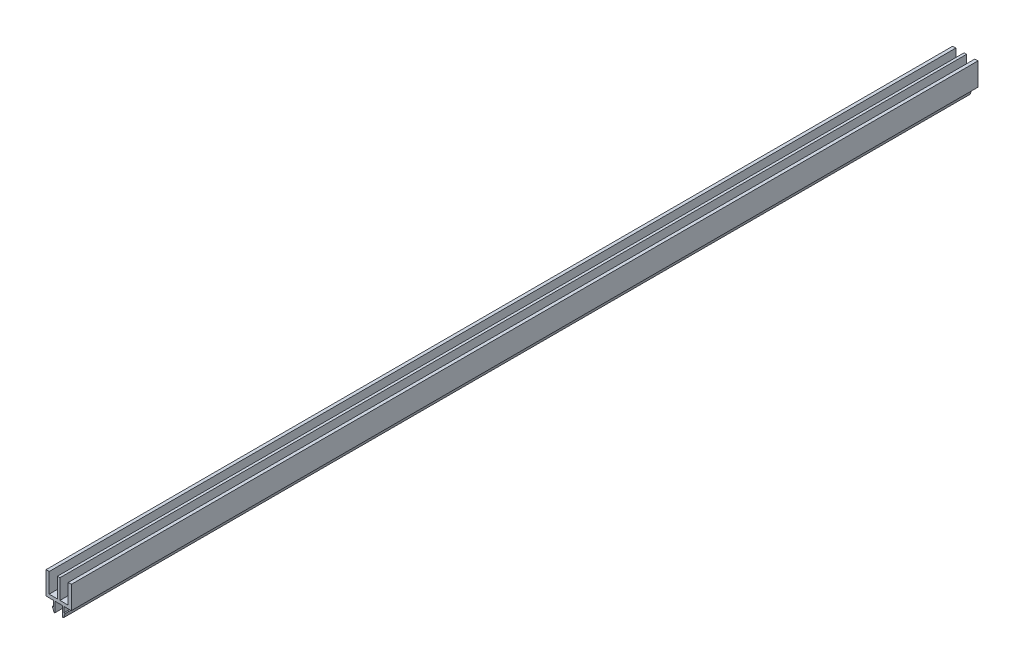
ISO-10303-21;
HEADER;
FILE_DESCRIPTION(('STEP AP214'),'2;1');
FILE_NAME('part.step','',(''),(''),'','','');
FILE_SCHEMA(('AUTOMOTIVE_DESIGN { 1 0 10303 214 1 1 1 1 }'));
ENDSEC;
DATA;
#1=APPLICATION_CONTEXT('core data for automotive mechanical design processes');
#2=APPLICATION_PROTOCOL_DEFINITION('international standard','automotive_design',2000,#1);
#3=PRODUCT_CONTEXT('',#1,'mechanical');
#4=PRODUCT('Part','Part','',(#3));
#5=PRODUCT_RELATED_PRODUCT_CATEGORY('part','',(#4));
#6=PRODUCT_DEFINITION_FORMATION('','',#4);
#7=PRODUCT_DEFINITION_CONTEXT('part definition',#1,'design');
#8=PRODUCT_DEFINITION('design','',#6,#7);
#9=PRODUCT_DEFINITION_SHAPE('','',#8);
#10=(LENGTH_UNIT() NAMED_UNIT(*) SI_UNIT(.MILLI.,.METRE.));
#11=(NAMED_UNIT(*) PLANE_ANGLE_UNIT() SI_UNIT($,.RADIAN.));
#12=(NAMED_UNIT(*) SI_UNIT($,.STERADIAN.) SOLID_ANGLE_UNIT());
#13=UNCERTAINTY_MEASURE_WITH_UNIT(LENGTH_MEASURE(1.E-05),#10,'distance_accuracy_value','');
#14=(GEOMETRIC_REPRESENTATION_CONTEXT(3) GLOBAL_UNCERTAINTY_ASSIGNED_CONTEXT((#13)) GLOBAL_UNIT_ASSIGNED_CONTEXT((#10,
#11,#12)) REPRESENTATION_CONTEXT('',''));
#15=CARTESIAN_POINT('',(0.,0.,0.));
#16=DIRECTION('',(0.,0.,1.));
#17=DIRECTION('',(1.,0.,0.));
#18=AXIS2_PLACEMENT_3D('',#15,#16,#17);
#19=CARTESIAN_POINT('',(-1.,17.9999999975,-665.));
#20=DIRECTION('',(-1.,0.,0.));
#21=DIRECTION('',(0.,-1.,0.));
#22=AXIS2_PLACEMENT_3D('',#19,#20,#21);
#23=PLANE('',#22);
#24=DIRECTION('',(0.,-1.,0.));
#25=VECTOR('',#24,1.);
#26=CARTESIAN_POINT('',(-1.,17.9999999975,50.));
#27=LINE('',#26,#25);
#28=CARTESIAN_POINT('',(-1.,17.9999999975,50.));
#29=VERTEX_POINT('',#28);
#30=CARTESIAN_POINT('',(-1.,2.4999999995,50.));
#31=VERTEX_POINT('',#30);
#32=EDGE_CURVE('E228',#29,#31,#27,.T.);
#33=ORIENTED_EDGE('',*,*,#32,.F.);
#34=DIRECTION('',(0.,0.,1.));
#35=VECTOR('',#34,1.);
#36=CARTESIAN_POINT('',(-1.,17.9999999975,-665.));
#37=LINE('',#36,#35);
#38=CARTESIAN_POINT('',(-1.,17.9999999975,-665.));
#39=VERTEX_POINT('',#38);
#40=EDGE_CURVE('E11',#39,#29,#37,.T.);
#41=ORIENTED_EDGE('',*,*,#40,.F.);
#42=DIRECTION('',(0.,-1.,0.));
#43=VECTOR('',#42,1.);
#44=CARTESIAN_POINT('',(-1.,17.9999999975,-665.));
#45=LINE('',#44,#43);
#46=CARTESIAN_POINT('',(-1.,2.4999999995,-665.));
#47=VERTEX_POINT('',#46);
#48=EDGE_CURVE('E296',#39,#47,#45,.T.);
#49=ORIENTED_EDGE('',*,*,#48,.T.);
#50=DIRECTION('',(0.,0.,1.));
#51=VECTOR('',#50,1.);
#52=CARTESIAN_POINT('',(-1.,2.4999999995,-665.));
#53=LINE('',#52,#51);
#54=EDGE_CURVE('E38',#47,#31,#53,.T.);
#55=ORIENTED_EDGE('',*,*,#54,.T.);
#56=EDGE_LOOP('',(#33,#41,#49,#55));
#57=FACE_BOUND('',#56,.T.);
#58=ADVANCED_FACE('F35',(#57),#23,.T.);
#59=CARTESIAN_POINT('',(0.999999999999998,17.9999999975,-665.));
#60=DIRECTION('',(0.,1.,0.));
#61=DIRECTION('',(0.,0.,1.));
#62=AXIS2_PLACEMENT_3D('',#59,#60,#61);
#63=PLANE('',#62);
#64=DIRECTION('',(-1.,0.,0.));
#65=VECTOR('',#64,1.);
#66=CARTESIAN_POINT('',(0.999999999999998,17.9999999975,50.));
#67=LINE('',#66,#65);
#68=CARTESIAN_POINT('',(0.999999999999998,17.9999999975,50.));
#69=VERTEX_POINT('',#68);
#70=EDGE_CURVE('E294',#69,#29,#67,.T.);
#71=ORIENTED_EDGE('',*,*,#70,.F.);
#72=DIRECTION('',(0.,0.,1.));
#73=VECTOR('',#72,1.);
#74=CARTESIAN_POINT('',(0.999999999999998,17.9999999975,-665.));
#75=LINE('',#74,#73);
#76=CARTESIAN_POINT('',(0.999999999999998,17.9999999975,-665.));
#77=VERTEX_POINT('',#76);
#78=EDGE_CURVE('E44',#77,#69,#75,.T.);
#79=ORIENTED_EDGE('',*,*,#78,.F.);
#80=DIRECTION('',(-1.,0.,0.));
#81=VECTOR('',#80,1.);
#82=CARTESIAN_POINT('',(0.999999999999998,17.9999999975,-665.));
#83=LINE('',#82,#81);
#84=EDGE_CURVE('E218',#77,#39,#83,.T.);
#85=ORIENTED_EDGE('',*,*,#84,.T.);
#86=ORIENTED_EDGE('',*,*,#40,.T.);
#87=EDGE_LOOP('',(#71,#79,#85,#86));
#88=FACE_BOUND('',#87,.T.);
#89=ADVANCED_FACE('F340',(#88),#63,.T.);
#90=CARTESIAN_POINT('',(0.999999999999998,2.4999999995,-665.));
#91=DIRECTION('',(1.,0.,0.));
#92=DIRECTION('',(0.,0.,-1.));
#93=AXIS2_PLACEMENT_3D('',#90,#91,#92);
#94=PLANE('',#93);
#95=DIRECTION('',(0.,1.,0.));
#96=VECTOR('',#95,1.);
#97=CARTESIAN_POINT('',(0.999999999999998,2.4999999995,50.));
#98=LINE('',#97,#96);
#99=CARTESIAN_POINT('',(0.999999999999998,2.4999999995,50.));
#100=VERTEX_POINT('',#99);
#101=EDGE_CURVE('E205',#100,#69,#98,.T.);
#102=ORIENTED_EDGE('',*,*,#101,.F.);
#103=DIRECTION('',(0.,0.,1.));
#104=VECTOR('',#103,1.);
#105=CARTESIAN_POINT('',(0.999999999999998,2.4999999995,-665.));
#106=LINE('',#105,#104);
#107=CARTESIAN_POINT('',(0.999999999999998,2.4999999995,-665.));
#108=VERTEX_POINT('',#107);
#109=EDGE_CURVE('E200',#108,#100,#106,.T.);
#110=ORIENTED_EDGE('',*,*,#109,.F.);
#111=DIRECTION('',(0.,1.,0.));
#112=VECTOR('',#111,1.);
#113=CARTESIAN_POINT('',(0.999999999999998,2.4999999995,-665.));
#114=LINE('',#113,#112);
#115=EDGE_CURVE('E203',#108,#77,#114,.T.);
#116=ORIENTED_EDGE('',*,*,#115,.T.);
#117=ORIENTED_EDGE('',*,*,#78,.T.);
#118=EDGE_LOOP('',(#102,#110,#116,#117));
#119=FACE_BOUND('',#118,.T.);
#120=ADVANCED_FACE('F202',(#119),#94,.T.);
#121=CARTESIAN_POINT('',(7.5,2.4999999995,-665.));
#122=DIRECTION('',(0.,1.,0.));
#123=DIRECTION('',(-1.,0.,0.));
#124=AXIS2_PLACEMENT_3D('',#121,#122,#123);
#125=PLANE('',#124);
#126=DIRECTION('',(-1.,0.,0.));
#127=VECTOR('',#126,1.);
#128=CARTESIAN_POINT('',(7.5,2.4999999995,50.));
#129=LINE('',#128,#127);
#130=CARTESIAN_POINT('',(7.5,2.4999999995,50.));
#131=VERTEX_POINT('',#130);
#132=EDGE_CURVE('E291',#131,#100,#129,.T.);
#133=ORIENTED_EDGE('',*,*,#132,.F.);
#134=DIRECTION('',(0.,0.,1.));
#135=VECTOR('',#134,1.);
#136=CARTESIAN_POINT('',(7.5,2.4999999995,-665.));
#137=LINE('',#136,#135);
#138=CARTESIAN_POINT('',(7.5,2.4999999995,-665.));
#139=VERTEX_POINT('',#138);
#140=EDGE_CURVE('E210',#139,#131,#137,.T.);
#141=ORIENTED_EDGE('',*,*,#140,.F.);
#142=DIRECTION('',(-1.,0.,0.));
#143=VECTOR('',#142,1.);
#144=CARTESIAN_POINT('',(7.5,2.4999999995,-665.));
#145=LINE('',#144,#143);
#146=EDGE_CURVE('E216',#139,#108,#145,.T.);
#147=ORIENTED_EDGE('',*,*,#146,.T.);
#148=ORIENTED_EDGE('',*,*,#109,.T.);
#149=EDGE_LOOP('',(#133,#141,#147,#148));
#150=FACE_BOUND('',#149,.T.);
#151=ADVANCED_FACE('F220',(#150),#125,.T.);
#152=CARTESIAN_POINT('',(7.5,17.9999999975,-665.));
#153=DIRECTION('',(-1.,0.,0.));
#154=DIRECTION('',(0.,-1.,0.));
#155=AXIS2_PLACEMENT_3D('',#152,#153,#154);
#156=PLANE('',#155);
#157=DIRECTION('',(0.,-1.,0.));
#158=VECTOR('',#157,1.);
#159=CARTESIAN_POINT('',(7.5,17.9999999975,50.));
#160=LINE('',#159,#158);
#161=CARTESIAN_POINT('',(7.5,17.9999999975,50.));
#162=VERTEX_POINT('',#161);
#163=EDGE_CURVE('E288',#162,#131,#160,.T.);
#164=ORIENTED_EDGE('',*,*,#163,.F.);
#165=DIRECTION('',(0.,0.,1.));
#166=VECTOR('',#165,1.);
#167=CARTESIAN_POINT('',(7.5,17.9999999975,-665.));
#168=LINE('',#167,#166);
#169=CARTESIAN_POINT('',(7.5,17.9999999975,-665.));
#170=VERTEX_POINT('',#169);
#171=EDGE_CURVE('E300',#170,#162,#168,.T.);
#172=ORIENTED_EDGE('',*,*,#171,.F.);
#173=DIRECTION('',(0.,-1.,0.));
#174=VECTOR('',#173,1.);
#175=CARTESIAN_POINT('',(7.5,17.9999999975,-665.));
#176=LINE('',#175,#174);
#177=EDGE_CURVE('E221',#170,#139,#176,.T.);
#178=ORIENTED_EDGE('',*,*,#177,.T.);
#179=ORIENTED_EDGE('',*,*,#140,.T.);
#180=EDGE_LOOP('',(#164,#172,#178,#179));
#181=FACE_BOUND('',#180,.T.);
#182=ADVANCED_FACE('F353',(#181),#156,.T.);
#183=CARTESIAN_POINT('',(10.,17.9999999975,-665.));
#184=DIRECTION('',(0.,1.,0.));
#185=DIRECTION('',(0.,0.,1.));
#186=AXIS2_PLACEMENT_3D('',#183,#184,#185);
#187=PLANE('',#186);
#188=DIRECTION('',(-1.,0.,0.));
#189=VECTOR('',#188,1.);
#190=CARTESIAN_POINT('',(10.,17.9999999975,50.));
#191=LINE('',#190,#189);
#192=CARTESIAN_POINT('',(10.,17.9999999975,50.));
#193=VERTEX_POINT('',#192);
#194=EDGE_CURVE('E285',#193,#162,#191,.T.);
#195=ORIENTED_EDGE('',*,*,#194,.F.);
#196=DIRECTION('',(0.,0.,1.));
#197=VECTOR('',#196,1.);
#198=CARTESIAN_POINT('',(10.,17.9999999975,-665.));
#199=LINE('',#198,#197);
#200=CARTESIAN_POINT('',(10.,17.9999999975,-665.));
#201=VERTEX_POINT('',#200);
#202=EDGE_CURVE('E302',#201,#193,#199,.T.);
#203=ORIENTED_EDGE('',*,*,#202,.F.);
#204=DIRECTION('',(-1.,0.,0.));
#205=VECTOR('',#204,1.);
#206=CARTESIAN_POINT('',(10.,17.9999999975,-665.));
#207=LINE('',#206,#205);
#208=EDGE_CURVE('E223',#201,#170,#207,.T.);
#209=ORIENTED_EDGE('',*,*,#208,.T.);
#210=ORIENTED_EDGE('',*,*,#171,.T.);
#211=EDGE_LOOP('',(#195,#203,#209,#210));
#212=FACE_BOUND('',#211,.T.);
#213=ADVANCED_FACE('F356',(#212),#187,.T.);
#214=CARTESIAN_POINT('',(10.,-4.99999828349541E-10,-665.));
#215=DIRECTION('',(1.,0.,0.));
#216=DIRECTION('',(0.,0.,-1.));
#217=AXIS2_PLACEMENT_3D('',#214,#215,#216);
#218=PLANE('',#217);
#219=DIRECTION('',(0.,1.,0.));
#220=VECTOR('',#219,1.);
#221=CARTESIAN_POINT('',(10.,-4.99999828349541E-10,50.));
#222=LINE('',#221,#220);
#223=CARTESIAN_POINT('',(10.,-4.99999828349541E-10,50.));
#224=VERTEX_POINT('',#223);
#225=EDGE_CURVE('E282',#224,#193,#222,.T.);
#226=ORIENTED_EDGE('',*,*,#225,.F.);
#227=DIRECTION('',(0.,0.,1.));
#228=VECTOR('',#227,1.);
#229=CARTESIAN_POINT('',(10.,-4.99999828349541E-10,-665.));
#230=LINE('',#229,#228);
#231=CARTESIAN_POINT('',(10.,-4.99999828349541E-10,-665.));
#232=VERTEX_POINT('',#231);
#233=EDGE_CURVE('E304',#232,#224,#230,.T.);
#234=ORIENTED_EDGE('',*,*,#233,.F.);
#235=DIRECTION('',(0.,1.,0.));
#236=VECTOR('',#235,1.);
#237=CARTESIAN_POINT('',(10.,-4.99999828349541E-10,-665.));
#238=LINE('',#237,#236);
#239=EDGE_CURVE('E646',#232,#201,#238,.T.);
#240=ORIENTED_EDGE('',*,*,#239,.T.);
#241=ORIENTED_EDGE('',*,*,#202,.T.);
#242=EDGE_LOOP('',(#226,#234,#240,#241));
#243=FACE_BOUND('',#242,.T.);
#244=ADVANCED_FACE('F360',(#243),#218,.T.);
#245=CARTESIAN_POINT('',(4.,-4.99999998002099E-10,-665.));
#246=DIRECTION('',(0.,-1.,0.));
#247=DIRECTION('',(1.,0.,0.));
#248=AXIS2_PLACEMENT_3D('',#245,#246,#247);
#249=PLANE('',#248);
#250=DIRECTION('',(1.,0.,0.));
#251=VECTOR('',#250,1.);
#252=CARTESIAN_POINT('',(4.,-4.99999998002099E-10,50.));
#253=LINE('',#252,#251);
#254=CARTESIAN_POINT('',(4.,-4.99999998002099E-10,50.));
#255=VERTEX_POINT('',#254);
#256=EDGE_CURVE('E279',#255,#224,#253,.T.);
#257=ORIENTED_EDGE('',*,*,#256,.F.);
#258=DIRECTION('',(0.,0.,1.));
#259=VECTOR('',#258,1.);
#260=CARTESIAN_POINT('',(4.,-4.99999998002099E-10,-665.));
#261=LINE('',#260,#259);
#262=CARTESIAN_POINT('',(4.,-4.99999998002099E-10,-665.));
#263=VERTEX_POINT('',#262);
#264=EDGE_CURVE('E306',#263,#255,#261,.T.);
#265=ORIENTED_EDGE('',*,*,#264,.F.);
#266=DIRECTION('',(1.,0.,0.));
#267=VECTOR('',#266,1.);
#268=CARTESIAN_POINT('',(4.,-4.99999998002099E-10,-665.));
#269=LINE('',#268,#267);
#270=EDGE_CURVE('E650',#263,#232,#269,.T.);
#271=ORIENTED_EDGE('',*,*,#270,.T.);
#272=ORIENTED_EDGE('',*,*,#233,.T.);
#273=EDGE_LOOP('',(#257,#265,#271,#272));
#274=FACE_BOUND('',#273,.T.);
#275=ADVANCED_FACE('F364',(#274),#249,.T.);
#276=CARTESIAN_POINT('',(4.,-4.5,-665.));
#277=DIRECTION('',(1.,0.,0.));
#278=DIRECTION('',(0.,0.,-1.));
#279=AXIS2_PLACEMENT_3D('',#276,#277,#278);
#280=PLANE('',#279);
#281=DIRECTION('',(0.,1.,0.));
#282=VECTOR('',#281,1.);
#283=CARTESIAN_POINT('',(4.,-4.5,50.));
#284=LINE('',#283,#282);
#285=CARTESIAN_POINT('',(4.,-4.5,50.));
#286=VERTEX_POINT('',#285);
#287=EDGE_CURVE('E276',#286,#255,#284,.T.);
#288=ORIENTED_EDGE('',*,*,#287,.F.);
#289=DIRECTION('',(0.,0.,1.));
#290=VECTOR('',#289,1.);
#291=CARTESIAN_POINT('',(4.,-4.5,-665.));
#292=LINE('',#291,#290);
#293=CARTESIAN_POINT('',(4.,-4.5,-665.));
#294=VERTEX_POINT('',#293);
#295=EDGE_CURVE('E308',#294,#286,#292,.T.);
#296=ORIENTED_EDGE('',*,*,#295,.F.);
#297=DIRECTION('',(0.,1.,0.));
#298=VECTOR('',#297,1.);
#299=CARTESIAN_POINT('',(4.,-4.5,-665.));
#300=LINE('',#299,#298);
#301=EDGE_CURVE('E639',#294,#263,#300,.T.);
#302=ORIENTED_EDGE('',*,*,#301,.T.);
#303=ORIENTED_EDGE('',*,*,#264,.T.);
#304=EDGE_LOOP('',(#288,#296,#302,#303));
#305=FACE_BOUND('',#304,.T.);
#306=ADVANCED_FACE('F368',(#305),#280,.T.);
#307=CARTESIAN_POINT('',(5.,-4.5,-665.));
#308=DIRECTION('',(0.,1.,0.));
#309=DIRECTION('',(0.,0.,1.));
#310=AXIS2_PLACEMENT_3D('',#307,#308,#309);
#311=PLANE('',#310);
#312=DIRECTION('',(-1.,0.,0.));
#313=VECTOR('',#312,1.);
#314=CARTESIAN_POINT('',(5.,-4.5,50.));
#315=LINE('',#314,#313);
#316=CARTESIAN_POINT('',(5.,-4.5,50.));
#317=VERTEX_POINT('',#316);
#318=EDGE_CURVE('E273',#317,#286,#315,.T.);
#319=ORIENTED_EDGE('',*,*,#318,.F.);
#320=DIRECTION('',(0.,0.,1.));
#321=VECTOR('',#320,1.);
#322=CARTESIAN_POINT('',(5.,-4.5,-665.));
#323=LINE('',#322,#321);
#324=CARTESIAN_POINT('',(5.,-4.5,-665.));
#325=VERTEX_POINT('',#324);
#326=EDGE_CURVE('E310',#325,#317,#323,.T.);
#327=ORIENTED_EDGE('',*,*,#326,.F.);
#328=DIRECTION('',(-1.,0.,0.));
#329=VECTOR('',#328,1.);
#330=CARTESIAN_POINT('',(5.,-4.5,-665.));
#331=LINE('',#330,#329);
#332=EDGE_CURVE('E635',#325,#294,#331,.T.);
#333=ORIENTED_EDGE('',*,*,#332,.T.);
#334=ORIENTED_EDGE('',*,*,#295,.T.);
#335=EDGE_LOOP('',(#319,#327,#333,#334));
#336=FACE_BOUND('',#335,.T.);
#337=ADVANCED_FACE('F372',(#336),#311,.T.);
#338=CARTESIAN_POINT('',(3.75,-8.,-665.));
#339=DIRECTION('',(0.941741911594837,-0.336336396998156,0.));
#340=DIRECTION('',(0.336336396998157,0.941741911594838,0.));
#341=AXIS2_PLACEMENT_3D('',#338,#339,#340);
#342=PLANE('',#341);
#343=DIRECTION('',(0.336336396998157,0.941741911594837,0.));
#344=VECTOR('',#343,1.);
#345=CARTESIAN_POINT('',(3.75,-8.,50.));
#346=LINE('',#345,#344);
#347=CARTESIAN_POINT('',(3.75,-8.,50.));
#348=VERTEX_POINT('',#347);
#349=EDGE_CURVE('E270',#348,#317,#346,.T.);
#350=ORIENTED_EDGE('',*,*,#349,.F.);
#351=DIRECTION('',(0.,0.,1.));
#352=VECTOR('',#351,1.);
#353=CARTESIAN_POINT('',(3.75,-8.,-665.));
#354=LINE('',#353,#352);
#355=CARTESIAN_POINT('',(3.75,-8.,-665.));
#356=VERTEX_POINT('',#355);
#357=EDGE_CURVE('E312',#356,#348,#354,.T.);
#358=ORIENTED_EDGE('',*,*,#357,.F.);
#359=DIRECTION('',(0.336336396998157,0.941741911594837,0.));
#360=VECTOR('',#359,1.);
#361=CARTESIAN_POINT('',(3.75,-8.,-665.));
#362=LINE('',#361,#360);
#363=EDGE_CURVE('E656',#356,#325,#362,.T.);
#364=ORIENTED_EDGE('',*,*,#363,.T.);
#365=ORIENTED_EDGE('',*,*,#326,.T.);
#366=EDGE_LOOP('',(#350,#358,#364,#365));
#367=FACE_BOUND('',#366,.T.);
#368=ADVANCED_FACE('F376',(#367),#342,.T.);
#369=CARTESIAN_POINT('',(3.,-8.,-665.));
#370=DIRECTION('',(0.,-1.,0.));
#371=DIRECTION('',(0.,0.,-1.));
#372=AXIS2_PLACEMENT_3D('',#369,#370,#371);
#373=PLANE('',#372);
#374=DIRECTION('',(1.,0.,0.));
#375=VECTOR('',#374,1.);
#376=CARTESIAN_POINT('',(3.,-8.,50.));
#377=LINE('',#376,#375);
#378=CARTESIAN_POINT('',(3.,-8.,50.));
#379=VERTEX_POINT('',#378);
#380=EDGE_CURVE('E267',#379,#348,#377,.T.);
#381=ORIENTED_EDGE('',*,*,#380,.F.);
#382=DIRECTION('',(0.,0.,1.));
#383=VECTOR('',#382,1.);
#384=CARTESIAN_POINT('',(3.,-8.,-665.));
#385=LINE('',#384,#383);
#386=CARTESIAN_POINT('',(3.,-8.,-665.));
#387=VERTEX_POINT('',#386);
#388=EDGE_CURVE('E314',#387,#379,#385,.T.);
#389=ORIENTED_EDGE('',*,*,#388,.F.);
#390=DIRECTION('',(1.,0.,0.));
#391=VECTOR('',#390,1.);
#392=CARTESIAN_POINT('',(3.,-8.,-665.));
#393=LINE('',#392,#391);
#394=EDGE_CURVE('E628',#387,#356,#393,.T.);
#395=ORIENTED_EDGE('',*,*,#394,.T.);
#396=ORIENTED_EDGE('',*,*,#357,.T.);
#397=EDGE_LOOP('',(#381,#389,#395,#396));
#398=FACE_BOUND('',#397,.T.);
#399=ADVANCED_FACE('F380',(#398),#373,.T.);
#400=CARTESIAN_POINT('',(3.,-4.9999985194348E-10,-665.));
#401=DIRECTION('',(-1.,0.,0.));
#402=DIRECTION('',(0.,0.,1.));
#403=AXIS2_PLACEMENT_3D('',#400,#401,#402);
#404=PLANE('',#403);
#405=DIRECTION('',(0.,-1.,0.));
#406=VECTOR('',#405,1.);
#407=CARTESIAN_POINT('',(3.,-4.9999985194348E-10,50.));
#408=LINE('',#407,#406);
#409=CARTESIAN_POINT('',(3.,-4.9999985194348E-10,50.));
#410=VERTEX_POINT('',#409);
#411=EDGE_CURVE('E264',#410,#379,#408,.T.);
#412=ORIENTED_EDGE('',*,*,#411,.F.);
#413=DIRECTION('',(0.,0.,1.));
#414=VECTOR('',#413,1.);
#415=CARTESIAN_POINT('',(3.,-4.9999985194348E-10,-665.));
#416=LINE('',#415,#414);
#417=CARTESIAN_POINT('',(3.,-4.9999985194348E-10,-665.));
#418=VERTEX_POINT('',#417);
#419=EDGE_CURVE('E316',#418,#410,#416,.T.);
#420=ORIENTED_EDGE('',*,*,#419,.F.);
#421=DIRECTION('',(0.,-1.,0.));
#422=VECTOR('',#421,1.);
#423=CARTESIAN_POINT('',(3.,-4.9999985194348E-10,-665.));
#424=LINE('',#423,#422);
#425=EDGE_CURVE('E624',#418,#387,#424,.T.);
#426=ORIENTED_EDGE('',*,*,#425,.T.);
#427=ORIENTED_EDGE('',*,*,#388,.T.);
#428=EDGE_LOOP('',(#412,#420,#426,#427));
#429=FACE_BOUND('',#428,.T.);
#430=ADVANCED_FACE('F384',(#429),#404,.T.);
#431=CARTESIAN_POINT('',(-3.,-4.99999455901012E-10,-665.));
#432=DIRECTION('',(0.,-1.,0.));
#433=DIRECTION('',(1.,0.,0.));
#434=AXIS2_PLACEMENT_3D('',#431,#432,#433);
#435=PLANE('',#434);
#436=DIRECTION('',(1.,0.,0.));
#437=VECTOR('',#436,1.);
#438=CARTESIAN_POINT('',(-3.,-4.99999455901012E-10,50.));
#439=LINE('',#438,#437);
#440=CARTESIAN_POINT('',(-3.,-4.99999455901012E-10,50.));
#441=VERTEX_POINT('',#440);
#442=EDGE_CURVE('E261',#441,#410,#439,.T.);
#443=ORIENTED_EDGE('',*,*,#442,.F.);
#444=DIRECTION('',(0.,0.,1.));
#445=VECTOR('',#444,1.);
#446=CARTESIAN_POINT('',(-3.,-4.99999455901012E-10,-665.));
#447=LINE('',#446,#445);
#448=CARTESIAN_POINT('',(-3.,-4.99999455901012E-10,-665.));
#449=VERTEX_POINT('',#448);
#450=EDGE_CURVE('E318',#449,#441,#447,.T.);
#451=ORIENTED_EDGE('',*,*,#450,.F.);
#452=DIRECTION('',(1.,0.,0.));
#453=VECTOR('',#452,1.);
#454=CARTESIAN_POINT('',(-3.,-4.99999455901012E-10,-665.));
#455=LINE('',#454,#453);
#456=EDGE_CURVE('E660',#449,#418,#455,.T.);
#457=ORIENTED_EDGE('',*,*,#456,.T.);
#458=ORIENTED_EDGE('',*,*,#419,.T.);
#459=EDGE_LOOP('',(#443,#451,#457,#458));
#460=FACE_BOUND('',#459,.T.);
#461=ADVANCED_FACE('F388',(#460),#435,.T.);
#462=CARTESIAN_POINT('',(-3.,-8.,-665.));
#463=DIRECTION('',(1.,0.,0.));
#464=DIRECTION('',(0.,0.,-1.));
#465=AXIS2_PLACEMENT_3D('',#462,#463,#464);
#466=PLANE('',#465);
#467=DIRECTION('',(0.,1.,0.));
#468=VECTOR('',#467,1.);
#469=CARTESIAN_POINT('',(-3.,-8.,50.));
#470=LINE('',#469,#468);
#471=CARTESIAN_POINT('',(-3.,-8.,50.));
#472=VERTEX_POINT('',#471);
#473=EDGE_CURVE('E258',#472,#441,#470,.T.);
#474=ORIENTED_EDGE('',*,*,#473,.F.);
#475=DIRECTION('',(0.,0.,1.));
#476=VECTOR('',#475,1.);
#477=CARTESIAN_POINT('',(-3.,-8.,-665.));
#478=LINE('',#477,#476);
#479=CARTESIAN_POINT('',(-3.,-8.,-665.));
#480=VERTEX_POINT('',#479);
#481=EDGE_CURVE('E320',#480,#472,#478,.T.);
#482=ORIENTED_EDGE('',*,*,#481,.F.);
#483=DIRECTION('',(0.,1.,0.));
#484=VECTOR('',#483,1.);
#485=CARTESIAN_POINT('',(-3.,-8.,-665.));
#486=LINE('',#485,#484);
#487=EDGE_CURVE('E617',#480,#449,#486,.T.);
#488=ORIENTED_EDGE('',*,*,#487,.T.);
#489=ORIENTED_EDGE('',*,*,#450,.T.);
#490=EDGE_LOOP('',(#474,#482,#488,#489));
#491=FACE_BOUND('',#490,.T.);
#492=ADVANCED_FACE('F392',(#491),#466,.T.);
#493=CARTESIAN_POINT('',(-3.75,-8.,-665.));
#494=DIRECTION('',(0.,-1.,0.));
#495=DIRECTION('',(0.,0.,-1.));
#496=AXIS2_PLACEMENT_3D('',#493,#494,#495);
#497=PLANE('',#496);
#498=DIRECTION('',(1.,0.,0.));
#499=VECTOR('',#498,1.);
#500=CARTESIAN_POINT('',(-3.75,-8.,50.));
#501=LINE('',#500,#499);
#502=CARTESIAN_POINT('',(-3.75,-8.,50.));
#503=VERTEX_POINT('',#502);
#504=EDGE_CURVE('E255',#503,#472,#501,.T.);
#505=ORIENTED_EDGE('',*,*,#504,.F.);
#506=DIRECTION('',(0.,0.,1.));
#507=VECTOR('',#506,1.);
#508=CARTESIAN_POINT('',(-3.75,-8.,-665.));
#509=LINE('',#508,#507);
#510=CARTESIAN_POINT('',(-3.75,-8.,-665.));
#511=VERTEX_POINT('',#510);
#512=EDGE_CURVE('E322',#511,#503,#509,.T.);
#513=ORIENTED_EDGE('',*,*,#512,.F.);
#514=DIRECTION('',(1.,0.,0.));
#515=VECTOR('',#514,1.);
#516=CARTESIAN_POINT('',(-3.75,-8.,-665.));
#517=LINE('',#516,#515);
#518=EDGE_CURVE('E613',#511,#480,#517,.T.);
#519=ORIENTED_EDGE('',*,*,#518,.T.);
#520=ORIENTED_EDGE('',*,*,#481,.T.);
#521=EDGE_LOOP('',(#505,#513,#519,#520));
#522=FACE_BOUND('',#521,.T.);
#523=ADVANCED_FACE('F396',(#522),#497,.T.);
#524=CARTESIAN_POINT('',(-5.,-4.5,-665.));
#525=DIRECTION('',(-0.941741911594837,-0.336336396998156,0.));
#526=DIRECTION('',(0.336336396998156,-0.941741911594837,0.));
#527=AXIS2_PLACEMENT_3D('',#524,#525,#526);
#528=PLANE('',#527);
#529=DIRECTION('',(0.336336396998156,-0.941741911594837,0.));
#530=VECTOR('',#529,1.);
#531=CARTESIAN_POINT('',(-5.,-4.5,50.));
#532=LINE('',#531,#530);
#533=CARTESIAN_POINT('',(-5.,-4.5,50.));
#534=VERTEX_POINT('',#533);
#535=EDGE_CURVE('E252',#534,#503,#532,.T.);
#536=ORIENTED_EDGE('',*,*,#535,.F.);
#537=DIRECTION('',(0.,0.,1.));
#538=VECTOR('',#537,1.);
#539=CARTESIAN_POINT('',(-5.,-4.5,-665.));
#540=LINE('',#539,#538);
#541=CARTESIAN_POINT('',(-5.,-4.5,-665.));
#542=VERTEX_POINT('',#541);
#543=EDGE_CURVE('E324',#542,#534,#540,.T.);
#544=ORIENTED_EDGE('',*,*,#543,.F.);
#545=DIRECTION('',(0.336336396998156,-0.941741911594837,0.));
#546=VECTOR('',#545,1.);
#547=CARTESIAN_POINT('',(-5.,-4.5,-665.));
#548=LINE('',#547,#546);
#549=EDGE_CURVE('E664',#542,#511,#548,.T.);
#550=ORIENTED_EDGE('',*,*,#549,.T.);
#551=ORIENTED_EDGE('',*,*,#512,.T.);
#552=EDGE_LOOP('',(#536,#544,#550,#551));
#553=FACE_BOUND('',#552,.T.);
#554=ADVANCED_FACE('F400',(#553),#528,.T.);
#555=CARTESIAN_POINT('',(-4.,-4.5,-665.));
#556=DIRECTION('',(0.,1.,0.));
#557=DIRECTION('',(0.,0.,1.));
#558=AXIS2_PLACEMENT_3D('',#555,#556,#557);
#559=PLANE('',#558);
#560=DIRECTION('',(-1.,0.,0.));
#561=VECTOR('',#560,1.);
#562=CARTESIAN_POINT('',(-4.,-4.5,50.));
#563=LINE('',#562,#561);
#564=CARTESIAN_POINT('',(-4.,-4.5,50.));
#565=VERTEX_POINT('',#564);
#566=EDGE_CURVE('E249',#565,#534,#563,.T.);
#567=ORIENTED_EDGE('',*,*,#566,.F.);
#568=DIRECTION('',(0.,0.,1.));
#569=VECTOR('',#568,1.);
#570=CARTESIAN_POINT('',(-4.,-4.5,-665.));
#571=LINE('',#570,#569);
#572=CARTESIAN_POINT('',(-4.,-4.5,-665.));
#573=VERTEX_POINT('',#572);
#574=EDGE_CURVE('E326',#573,#565,#571,.T.);
#575=ORIENTED_EDGE('',*,*,#574,.F.);
#576=DIRECTION('',(-1.,0.,0.));
#577=VECTOR('',#576,1.);
#578=CARTESIAN_POINT('',(-4.,-4.5,-665.));
#579=LINE('',#578,#577);
#580=EDGE_CURVE('E606',#573,#542,#579,.T.);
#581=ORIENTED_EDGE('',*,*,#580,.T.);
#582=ORIENTED_EDGE('',*,*,#543,.T.);
#583=EDGE_LOOP('',(#567,#575,#581,#582));
#584=FACE_BOUND('',#583,.T.);
#585=ADVANCED_FACE('F404',(#584),#559,.T.);
#586=CARTESIAN_POINT('',(-4.,-4.9999985194348E-10,-665.));
#587=DIRECTION('',(-1.,0.,0.));
#588=DIRECTION('',(0.,0.,1.));
#589=AXIS2_PLACEMENT_3D('',#586,#587,#588);
#590=PLANE('',#589);
#591=DIRECTION('',(0.,-1.,0.));
#592=VECTOR('',#591,1.);
#593=CARTESIAN_POINT('',(-4.,-4.9999985194348E-10,50.));
#594=LINE('',#593,#592);
#595=CARTESIAN_POINT('',(-4.,-4.9999985194348E-10,50.));
#596=VERTEX_POINT('',#595);
#597=EDGE_CURVE('E246',#596,#565,#594,.T.);
#598=ORIENTED_EDGE('',*,*,#597,.F.);
#599=DIRECTION('',(0.,0.,1.));
#600=VECTOR('',#599,1.);
#601=CARTESIAN_POINT('',(-4.,-4.9999985194348E-10,-665.));
#602=LINE('',#601,#600);
#603=CARTESIAN_POINT('',(-4.,-4.9999985194348E-10,-665.));
#604=VERTEX_POINT('',#603);
#605=EDGE_CURVE('E328',#604,#596,#602,.T.);
#606=ORIENTED_EDGE('',*,*,#605,.F.);
#607=DIRECTION('',(0.,-1.,0.));
#608=VECTOR('',#607,1.);
#609=CARTESIAN_POINT('',(-4.,-4.9999985194348E-10,-665.));
#610=LINE('',#609,#608);
#611=EDGE_CURVE('E602',#604,#573,#610,.T.);
#612=ORIENTED_EDGE('',*,*,#611,.T.);
#613=ORIENTED_EDGE('',*,*,#574,.T.);
#614=EDGE_LOOP('',(#598,#606,#612,#613));
#615=FACE_BOUND('',#614,.T.);
#616=ADVANCED_FACE('F408',(#615),#590,.T.);
#617=CARTESIAN_POINT('',(-10.,-4.99999719929324E-10,-665.));
#618=DIRECTION('',(0.,-1.,0.));
#619=DIRECTION('',(1.,0.,0.));
#620=AXIS2_PLACEMENT_3D('',#617,#618,#619);
#621=PLANE('',#620);
#622=DIRECTION('',(1.,0.,0.));
#623=VECTOR('',#622,1.);
#624=CARTESIAN_POINT('',(-10.,-4.99999719929324E-10,50.));
#625=LINE('',#624,#623);
#626=CARTESIAN_POINT('',(-10.,-4.99999719929324E-10,50.));
#627=VERTEX_POINT('',#626);
#628=EDGE_CURVE('E243',#627,#596,#625,.T.);
#629=ORIENTED_EDGE('',*,*,#628,.F.);
#630=DIRECTION('',(0.,0.,1.));
#631=VECTOR('',#630,1.);
#632=CARTESIAN_POINT('',(-10.,-4.99999719929324E-10,-665.));
#633=LINE('',#632,#631);
#634=CARTESIAN_POINT('',(-10.,-4.99999719929324E-10,-665.));
#635=VERTEX_POINT('',#634);
#636=EDGE_CURVE('E330',#635,#627,#633,.T.);
#637=ORIENTED_EDGE('',*,*,#636,.F.);
#638=DIRECTION('',(1.,0.,0.));
#639=VECTOR('',#638,1.);
#640=CARTESIAN_POINT('',(-10.,-4.99999719929324E-10,-665.));
#641=LINE('',#640,#639);
#642=EDGE_CURVE('E668',#635,#604,#641,.T.);
#643=ORIENTED_EDGE('',*,*,#642,.T.);
#644=ORIENTED_EDGE('',*,*,#605,.T.);
#645=EDGE_LOOP('',(#629,#637,#643,#644));
#646=FACE_BOUND('',#645,.T.);
#647=ADVANCED_FACE('F412',(#646),#621,.T.);
#648=CARTESIAN_POINT('',(-10.,17.9999999975,-665.));
#649=DIRECTION('',(-1.,0.,0.));
#650=DIRECTION('',(0.,-1.,0.));
#651=AXIS2_PLACEMENT_3D('',#648,#649,#650);
#652=PLANE('',#651);
#653=DIRECTION('',(0.,-1.,0.));
#654=VECTOR('',#653,1.);
#655=CARTESIAN_POINT('',(-10.,17.9999999975,50.));
#656=LINE('',#655,#654);
#657=CARTESIAN_POINT('',(-10.,17.9999999975,50.));
#658=VERTEX_POINT('',#657);
#659=EDGE_CURVE('E240',#658,#627,#656,.T.);
#660=ORIENTED_EDGE('',*,*,#659,.F.);
#661=DIRECTION('',(0.,0.,1.));
#662=VECTOR('',#661,1.);
#663=CARTESIAN_POINT('',(-10.,17.9999999975,-665.));
#664=LINE('',#663,#662);
#665=CARTESIAN_POINT('',(-10.,17.9999999975,-665.));
#666=VERTEX_POINT('',#665);
#667=EDGE_CURVE('E332',#666,#658,#664,.T.);
#668=ORIENTED_EDGE('',*,*,#667,.F.);
#669=DIRECTION('',(0.,-1.,0.));
#670=VECTOR('',#669,1.);
#671=CARTESIAN_POINT('',(-10.,17.9999999975,-665.));
#672=LINE('',#671,#670);
#673=EDGE_CURVE('E595',#666,#635,#672,.T.);
#674=ORIENTED_EDGE('',*,*,#673,.T.);
#675=ORIENTED_EDGE('',*,*,#636,.T.);
#676=EDGE_LOOP('',(#660,#668,#674,#675));
#677=FACE_BOUND('',#676,.T.);
#678=ADVANCED_FACE('F416',(#677),#652,.T.);
#679=CARTESIAN_POINT('',(-7.5,17.9999999975,-665.));
#680=DIRECTION('',(0.,1.,0.));
#681=DIRECTION('',(0.,0.,1.));
#682=AXIS2_PLACEMENT_3D('',#679,#680,#681);
#683=PLANE('',#682);
#684=DIRECTION('',(-1.,0.,0.));
#685=VECTOR('',#684,1.);
#686=CARTESIAN_POINT('',(-7.5,17.9999999975,50.));
#687=LINE('',#686,#685);
#688=CARTESIAN_POINT('',(-7.5,17.9999999975,50.));
#689=VERTEX_POINT('',#688);
#690=EDGE_CURVE('E237',#689,#658,#687,.T.);
#691=ORIENTED_EDGE('',*,*,#690,.F.);
#692=DIRECTION('',(0.,0.,1.));
#693=VECTOR('',#692,1.);
#694=CARTESIAN_POINT('',(-7.5,17.9999999975,-665.));
#695=LINE('',#694,#693);
#696=CARTESIAN_POINT('',(-7.5,17.9999999975,-665.));
#697=VERTEX_POINT('',#696);
#698=EDGE_CURVE('E334',#697,#689,#695,.T.);
#699=ORIENTED_EDGE('',*,*,#698,.F.);
#700=DIRECTION('',(-1.,0.,0.));
#701=VECTOR('',#700,1.);
#702=CARTESIAN_POINT('',(-7.5,17.9999999975,-665.));
#703=LINE('',#702,#701);
#704=EDGE_CURVE('E591',#697,#666,#703,.T.);
#705=ORIENTED_EDGE('',*,*,#704,.T.);
#706=ORIENTED_EDGE('',*,*,#667,.T.);
#707=EDGE_LOOP('',(#691,#699,#705,#706));
#708=FACE_BOUND('',#707,.T.);
#709=ADVANCED_FACE('F420',(#708),#683,.T.);
#710=CARTESIAN_POINT('',(-7.5,2.4999999995,-665.));
#711=DIRECTION('',(1.,0.,0.));
#712=DIRECTION('',(0.,0.,-1.));
#713=AXIS2_PLACEMENT_3D('',#710,#711,#712);
#714=PLANE('',#713);
#715=DIRECTION('',(0.,1.,0.));
#716=VECTOR('',#715,1.);
#717=CARTESIAN_POINT('',(-7.5,2.4999999995,50.));
#718=LINE('',#717,#716);
#719=CARTESIAN_POINT('',(-7.5,2.4999999995,50.));
#720=VERTEX_POINT('',#719);
#721=EDGE_CURVE('E234',#720,#689,#718,.T.);
#722=ORIENTED_EDGE('',*,*,#721,.F.);
#723=DIRECTION('',(0.,0.,1.));
#724=VECTOR('',#723,1.);
#725=CARTESIAN_POINT('',(-7.5,2.4999999995,-665.));
#726=LINE('',#725,#724);
#727=CARTESIAN_POINT('',(-7.5,2.4999999995,-665.));
#728=VERTEX_POINT('',#727);
#729=EDGE_CURVE('E335',#728,#720,#726,.T.);
#730=ORIENTED_EDGE('',*,*,#729,.F.);
#731=DIRECTION('',(0.,1.,0.));
#732=VECTOR('',#731,1.);
#733=CARTESIAN_POINT('',(-7.5,2.4999999995,-665.));
#734=LINE('',#733,#732);
#735=EDGE_CURVE('E672',#728,#697,#734,.T.);
#736=ORIENTED_EDGE('',*,*,#735,.T.);
#737=ORIENTED_EDGE('',*,*,#698,.T.);
#738=EDGE_LOOP('',(#722,#730,#736,#737));
#739=FACE_BOUND('',#738,.T.);
#740=ADVANCED_FACE('F424',(#739),#714,.T.);
#741=CARTESIAN_POINT('',(-1.,2.4999999995,-665.));
#742=DIRECTION('',(0.,1.,0.));
#743=DIRECTION('',(-1.,0.,0.));
#744=AXIS2_PLACEMENT_3D('',#741,#742,#743);
#745=PLANE('',#744);
#746=DIRECTION('',(-1.,0.,0.));
#747=VECTOR('',#746,1.);
#748=CARTESIAN_POINT('',(-1.,2.4999999995,50.));
#749=LINE('',#748,#747);
#750=EDGE_CURVE('E231',#31,#720,#749,.T.);
#751=ORIENTED_EDGE('',*,*,#750,.F.);
#752=ORIENTED_EDGE('',*,*,#54,.F.);
#753=DIRECTION('',(-1.,0.,0.));
#754=VECTOR('',#753,1.);
#755=CARTESIAN_POINT('',(-1.,2.4999999995,-665.));
#756=LINE('',#755,#754);
#757=EDGE_CURVE('E674',#47,#728,#756,.T.);
#758=ORIENTED_EDGE('',*,*,#757,.T.);
#759=ORIENTED_EDGE('',*,*,#729,.T.);
#760=EDGE_LOOP('',(#751,#752,#758,#759));
#761=FACE_BOUND('',#760,.T.);
#762=ADVANCED_FACE('F337',(#761),#745,.T.);
#763=CARTESIAN_POINT('',(0.,0.,-665.));
#764=DIRECTION('',(0.,0.,-1.));
#765=DIRECTION('',(-1.,0.,0.));
#766=AXIS2_PLACEMENT_3D('',#763,#764,#765);
#767=PLANE('',#766);
#768=ORIENTED_EDGE('',*,*,#48,.F.);
#769=ORIENTED_EDGE('',*,*,#84,.F.);
#770=ORIENTED_EDGE('',*,*,#115,.F.);
#771=ORIENTED_EDGE('',*,*,#146,.F.);
#772=ORIENTED_EDGE('',*,*,#177,.F.);
#773=ORIENTED_EDGE('',*,*,#208,.F.);
#774=ORIENTED_EDGE('',*,*,#239,.F.);
#775=ORIENTED_EDGE('',*,*,#270,.F.);
#776=ORIENTED_EDGE('',*,*,#301,.F.);
#777=ORIENTED_EDGE('',*,*,#332,.F.);
#778=ORIENTED_EDGE('',*,*,#363,.F.);
#779=ORIENTED_EDGE('',*,*,#394,.F.);
#780=ORIENTED_EDGE('',*,*,#425,.F.);
#781=ORIENTED_EDGE('',*,*,#456,.F.);
#782=ORIENTED_EDGE('',*,*,#487,.F.);
#783=ORIENTED_EDGE('',*,*,#518,.F.);
#784=ORIENTED_EDGE('',*,*,#549,.F.);
#785=ORIENTED_EDGE('',*,*,#580,.F.);
#786=ORIENTED_EDGE('',*,*,#611,.F.);
#787=ORIENTED_EDGE('',*,*,#642,.F.);
#788=ORIENTED_EDGE('',*,*,#673,.F.);
#789=ORIENTED_EDGE('',*,*,#704,.F.);
#790=ORIENTED_EDGE('',*,*,#735,.F.);
#791=ORIENTED_EDGE('',*,*,#757,.F.);
#792=EDGE_LOOP('',(#768,#769,#770,#771,#772,#773,#774,#775,#776,#777,#778,#779,#780,#781,#782,
#783,#784,#785,#786,#787,#788,#789,#790,#791));
#793=FACE_BOUND('',#792,.T.);
#794=ADVANCED_FACE('F214',(#793),#767,.T.);
#795=CARTESIAN_POINT('',(0.,0.,50.));
#796=DIRECTION('',(0.,0.,-1.));
#797=DIRECTION('',(-1.,0.,0.));
#798=AXIS2_PLACEMENT_3D('',#795,#796,#797);
#799=PLANE('',#798);
#800=ORIENTED_EDGE('',*,*,#32,.T.);
#801=ORIENTED_EDGE('',*,*,#750,.T.);
#802=ORIENTED_EDGE('',*,*,#721,.T.);
#803=ORIENTED_EDGE('',*,*,#690,.T.);
#804=ORIENTED_EDGE('',*,*,#659,.T.);
#805=ORIENTED_EDGE('',*,*,#628,.T.);
#806=ORIENTED_EDGE('',*,*,#597,.T.);
#807=ORIENTED_EDGE('',*,*,#566,.T.);
#808=ORIENTED_EDGE('',*,*,#535,.T.);
#809=ORIENTED_EDGE('',*,*,#504,.T.);
#810=ORIENTED_EDGE('',*,*,#473,.T.);
#811=ORIENTED_EDGE('',*,*,#442,.T.);
#812=ORIENTED_EDGE('',*,*,#411,.T.);
#813=ORIENTED_EDGE('',*,*,#380,.T.);
#814=ORIENTED_EDGE('',*,*,#349,.T.);
#815=ORIENTED_EDGE('',*,*,#318,.T.);
#816=ORIENTED_EDGE('',*,*,#287,.T.);
#817=ORIENTED_EDGE('',*,*,#256,.T.);
#818=ORIENTED_EDGE('',*,*,#225,.T.);
#819=ORIENTED_EDGE('',*,*,#194,.T.);
#820=ORIENTED_EDGE('',*,*,#163,.T.);
#821=ORIENTED_EDGE('',*,*,#132,.T.);
#822=ORIENTED_EDGE('',*,*,#101,.T.);
#823=ORIENTED_EDGE('',*,*,#70,.T.);
#824=EDGE_LOOP('',(#800,#801,#802,#803,#804,#805,#806,#807,#808,#809,#810,#811,#812,#813,#814,
#815,#816,#817,#818,#819,#820,#821,#822,#823));
#825=FACE_BOUND('',#824,.T.);
#826=ADVANCED_FACE('F339',(#825),#799,.F.);
#827=CLOSED_SHELL('',(#58,#89,#120,#151,#182,#213,#244,#275,#306,#337,#368,#399,#430,#461,#492,
#523,#554,#585,#616,#647,#678,#709,#740,#762,#794,#826));
#828=MANIFOLD_SOLID_BREP('B2',#827);
#829=ADVANCED_BREP_SHAPE_REPRESENTATION('',(#18,#828),#14);
#830=SHAPE_DEFINITION_REPRESENTATION(#9,#829);
ENDSEC;
END-ISO-10303-21;
